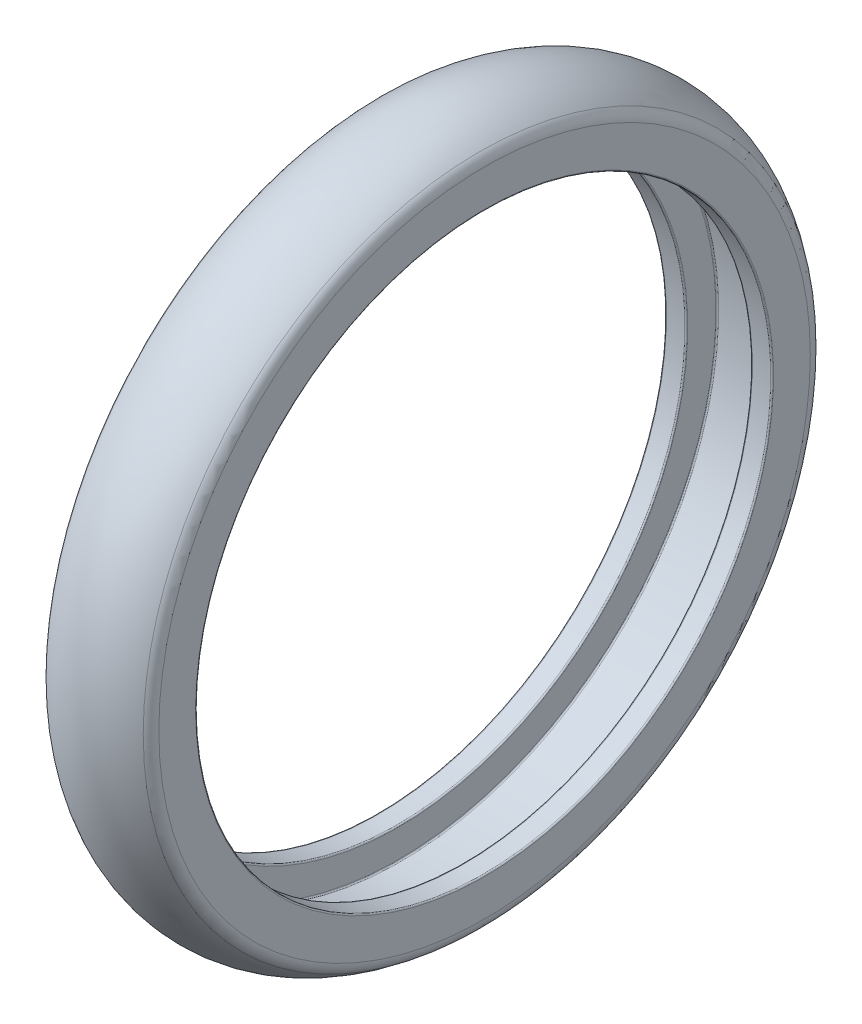
ISO-10303-21;
HEADER;
FILE_DESCRIPTION(('STEP AP214'),'2;1');
FILE_NAME('part.step','',(''),(''),'','','');
FILE_SCHEMA(('AUTOMOTIVE_DESIGN { 1 0 10303 214 1 1 1 1 }'));
ENDSEC;
DATA;
#1=APPLICATION_CONTEXT('core data for automotive mechanical design processes');
#2=APPLICATION_PROTOCOL_DEFINITION('international standard','automotive_design',2000,#1);
#3=PRODUCT_CONTEXT('',#1,'mechanical');
#4=PRODUCT('Part','Part','',(#3));
#5=PRODUCT_RELATED_PRODUCT_CATEGORY('part','',(#4));
#6=PRODUCT_DEFINITION_FORMATION('','',#4);
#7=PRODUCT_DEFINITION_CONTEXT('part definition',#1,'design');
#8=PRODUCT_DEFINITION('design','',#6,#7);
#9=PRODUCT_DEFINITION_SHAPE('','',#8);
#10=(LENGTH_UNIT() NAMED_UNIT(*) SI_UNIT(.MILLI.,.METRE.));
#11=(NAMED_UNIT(*) PLANE_ANGLE_UNIT() SI_UNIT($,.RADIAN.));
#12=(NAMED_UNIT(*) SI_UNIT($,.STERADIAN.) SOLID_ANGLE_UNIT());
#13=UNCERTAINTY_MEASURE_WITH_UNIT(LENGTH_MEASURE(1.E-05),#10,'distance_accuracy_value','');
#14=(GEOMETRIC_REPRESENTATION_CONTEXT(3) GLOBAL_UNCERTAINTY_ASSIGNED_CONTEXT((#13)) GLOBAL_UNIT_ASSIGNED_CONTEXT((#10,
#11,#12)) REPRESENTATION_CONTEXT('',''));
#15=CARTESIAN_POINT('',(0.,0.,0.));
#16=DIRECTION('',(0.,0.,1.));
#17=DIRECTION('',(1.,0.,0.));
#18=AXIS2_PLACEMENT_3D('',#15,#16,#17);
#19=CARTESIAN_POINT('',(2.27965,0.,0.));
#20=DIRECTION('',(-1.,0.,0.));
#21=DIRECTION('',(0.,0.,1.));
#22=AXIS2_PLACEMENT_3D('',#19,#20,#21);
#23=TOROIDAL_SURFACE('',#22,18.7006423557673,0.79375);
#24=CARTESIAN_POINT('',(2.78791956692352,0.,0.));
#25=DIRECTION('',(-1.,0.,0.));
#26=DIRECTION('',(0.,0.,1.));
#27=AXIS2_PLACEMENT_3D('',#24,#25,#26);
#28=CIRCLE('',#27,19.3103153089474);
#29=CARTESIAN_POINT('',(2.78791956692352,0.,19.3103153089474));
#30=VERTEX_POINT('',#29);
#31=EDGE_CURVE('E10',#30,#30,#28,.T.);
#32=ORIENTED_EDGE('',*,*,#31,.F.);
#33=EDGE_LOOP('',(#32));
#34=FACE_BOUND('',#33,.T.);
#35=CARTESIAN_POINT('',(3.0734,0.,0.));
#36=DIRECTION('',(-1.,0.,0.));
#37=DIRECTION('',(0.,0.,1.));
#38=AXIS2_PLACEMENT_3D('',#35,#36,#37);
#39=CIRCLE('',#38,18.7006423557673);
#40=CARTESIAN_POINT('',(3.0734,0.,18.7006423557673));
#41=VERTEX_POINT('',#40);
#42=EDGE_CURVE('E89',#41,#41,#39,.T.);
#43=ORIENTED_EDGE('',*,*,#42,.T.);
#44=EDGE_LOOP('',(#43));
#45=FACE_BOUND('',#44,.T.);
#46=ADVANCED_FACE('F37',(#34,#45),#23,.T.);
#47=CARTESIAN_POINT('',(0.,0.,0.));
#48=DIRECTION('',(-1.,0.,0.));
#49=DIRECTION('',(0.,0.,1.));
#50=AXIS2_PLACEMENT_3D('',#47,#48,#49);
#51=TOROIDAL_SURFACE('',#50,15.966186,4.353814);
#52=CARTESIAN_POINT('',(-2.78791956692352,0.,0.));
#53=DIRECTION('',(-1.,0.,0.));
#54=DIRECTION('',(0.,0.,1.));
#55=AXIS2_PLACEMENT_3D('',#52,#53,#54);
#56=CIRCLE('',#55,19.3103153089474);
#57=CARTESIAN_POINT('',(-2.78791956692352,0.,19.3103153089474));
#58=VERTEX_POINT('',#57);
#59=EDGE_CURVE('E43',#58,#58,#56,.T.);
#60=ORIENTED_EDGE('',*,*,#59,.F.);
#61=EDGE_LOOP('',(#60));
#62=FACE_BOUND('',#61,.T.);
#63=ORIENTED_EDGE('',*,*,#31,.T.);
#64=EDGE_LOOP('',(#63));
#65=FACE_BOUND('',#64,.T.);
#66=ADVANCED_FACE('F174',(#62,#65),#51,.T.);
#67=CARTESIAN_POINT('',(-2.27965,0.,0.));
#68=DIRECTION('',(-1.,0.,0.));
#69=DIRECTION('',(0.,0.,1.));
#70=AXIS2_PLACEMENT_3D('',#67,#68,#69);
#71=TOROIDAL_SURFACE('',#70,18.7006423557673,0.79375);
#72=CARTESIAN_POINT('',(-3.0734,0.,0.));
#73=DIRECTION('',(-1.,0.,0.));
#74=DIRECTION('',(0.,0.,1.));
#75=AXIS2_PLACEMENT_3D('',#72,#73,#74);
#76=CIRCLE('',#75,18.7006423557673);
#77=CARTESIAN_POINT('',(-3.0734,0.,18.7006423557673));
#78=VERTEX_POINT('',#77);
#79=EDGE_CURVE('E47',#78,#78,#76,.T.);
#80=ORIENTED_EDGE('',*,*,#79,.F.);
#81=EDGE_LOOP('',(#80));
#82=FACE_BOUND('',#81,.T.);
#83=ORIENTED_EDGE('',*,*,#59,.T.);
#84=EDGE_LOOP('',(#83));
#85=FACE_BOUND('',#84,.T.);
#86=ADVANCED_FACE('F169',(#82,#85),#71,.T.);
#87=CARTESIAN_POINT('',(-3.0734,16.589375,0.));
#88=DIRECTION('',(1.,0.,0.));
#89=DIRECTION('',(0.,0.,-1.));
#90=AXIS2_PLACEMENT_3D('',#87,#88,#89);
#91=PLANE('',#90);
#92=CARTESIAN_POINT('',(-3.0734,0.,0.));
#93=DIRECTION('',(-1.,0.,0.));
#94=DIRECTION('',(0.,0.,1.));
#95=AXIS2_PLACEMENT_3D('',#92,#93,#94);
#96=CIRCLE('',#95,16.589375);
#97=CARTESIAN_POINT('',(-3.0734,0.,16.589375));
#98=VERTEX_POINT('',#97);
#99=EDGE_CURVE('E51',#98,#98,#96,.T.);
#100=ORIENTED_EDGE('',*,*,#99,.F.);
#101=EDGE_LOOP('',(#100));
#102=FACE_BOUND('',#101,.T.);
#103=ORIENTED_EDGE('',*,*,#79,.T.);
#104=EDGE_LOOP('',(#103));
#105=FACE_BOUND('',#104,.T.);
#106=ADVANCED_FACE('F163',(#102,#105),#91,.F.);
#107=CARTESIAN_POINT('',(-2.994025,0.,0.));
#108=DIRECTION('',(-1.,0.,0.));
#109=DIRECTION('',(0.,0.,1.));
#110=AXIS2_PLACEMENT_3D('',#107,#108,#109);
#111=TOROIDAL_SURFACE('',#110,16.589375,0.0793749999999998);
#112=CARTESIAN_POINT('',(-2.994025,0.,0.));
#113=DIRECTION('',(-1.,0.,0.));
#114=DIRECTION('',(0.,0.,1.));
#115=AXIS2_PLACEMENT_3D('',#112,#113,#114);
#116=CIRCLE('',#115,16.51);
#117=CARTESIAN_POINT('',(-2.994025,0.,16.51));
#118=VERTEX_POINT('',#117);
#119=EDGE_CURVE('E56',#118,#118,#116,.T.);
#120=ORIENTED_EDGE('',*,*,#119,.F.);
#121=EDGE_LOOP('',(#120));
#122=FACE_BOUND('',#121,.T.);
#123=ORIENTED_EDGE('',*,*,#99,.T.);
#124=EDGE_LOOP('',(#123));
#125=FACE_BOUND('',#124,.T.);
#126=ADVANCED_FACE('F157',(#122,#125),#111,.T.);
#127=CARTESIAN_POINT('',(0.,0.,0.));
#128=DIRECTION('',(-1.,0.,0.));
#129=DIRECTION('',(0.,0.,1.));
#130=AXIS2_PLACEMENT_3D('',#127,#128,#129);
#131=CYLINDRICAL_SURFACE('',#130,16.51);
#132=CARTESIAN_POINT('',(-1.933575,0.,0.));
#133=DIRECTION('',(-1.,0.,0.));
#134=DIRECTION('',(0.,0.,1.));
#135=AXIS2_PLACEMENT_3D('',#132,#133,#134);
#136=CIRCLE('',#135,16.51);
#137=CARTESIAN_POINT('',(-1.933575,0.,16.51));
#138=VERTEX_POINT('',#137);
#139=EDGE_CURVE('E59',#138,#138,#136,.T.);
#140=ORIENTED_EDGE('',*,*,#139,.F.);
#141=EDGE_LOOP('',(#140));
#142=FACE_BOUND('',#141,.T.);
#143=ORIENTED_EDGE('',*,*,#119,.T.);
#144=EDGE_LOOP('',(#143));
#145=FACE_BOUND('',#144,.T.);
#146=ADVANCED_FACE('F151',(#142,#145),#131,.F.);
#147=CARTESIAN_POINT('',(-1.933575,0.,0.));
#148=DIRECTION('',(-1.,0.,0.));
#149=DIRECTION('',(0.,0.,1.));
#150=AXIS2_PLACEMENT_3D('',#147,#148,#149);
#151=TOROIDAL_SURFACE('',#150,16.589375,0.0793749999999998);
#152=CARTESIAN_POINT('',(-1.8542,0.,0.));
#153=DIRECTION('',(-1.,0.,0.));
#154=DIRECTION('',(0.,0.,1.));
#155=AXIS2_PLACEMENT_3D('',#152,#153,#154);
#156=CIRCLE('',#155,16.589375);
#157=CARTESIAN_POINT('',(-1.8542,0.,16.589375));
#158=VERTEX_POINT('',#157);
#159=EDGE_CURVE('E62',#158,#158,#156,.T.);
#160=ORIENTED_EDGE('',*,*,#159,.F.);
#161=EDGE_LOOP('',(#160));
#162=FACE_BOUND('',#161,.T.);
#163=ORIENTED_EDGE('',*,*,#139,.T.);
#164=EDGE_LOOP('',(#163));
#165=FACE_BOUND('',#164,.T.);
#166=ADVANCED_FACE('F145',(#162,#165),#151,.T.);
#167=CARTESIAN_POINT('',(-1.8542,18.208625,0.));
#168=DIRECTION('',(-1.,0.,0.));
#169=DIRECTION('',(0.,0.,1.));
#170=AXIS2_PLACEMENT_3D('',#167,#168,#169);
#171=PLANE('',#170);
#172=CARTESIAN_POINT('',(-1.8542,0.,0.));
#173=DIRECTION('',(-1.,0.,0.));
#174=DIRECTION('',(0.,0.,1.));
#175=AXIS2_PLACEMENT_3D('',#172,#173,#174);
#176=CIRCLE('',#175,18.208625);
#177=CARTESIAN_POINT('',(-1.8542,0.,18.208625));
#178=VERTEX_POINT('',#177);
#179=EDGE_CURVE('E65',#178,#178,#176,.T.);
#180=ORIENTED_EDGE('',*,*,#179,.F.);
#181=EDGE_LOOP('',(#180));
#182=FACE_BOUND('',#181,.T.);
#183=ORIENTED_EDGE('',*,*,#159,.T.);
#184=EDGE_LOOP('',(#183));
#185=FACE_BOUND('',#184,.T.);
#186=ADVANCED_FACE('F139',(#182,#185),#171,.F.);
#187=CARTESIAN_POINT('',(-1.774825,0.,0.));
#188=DIRECTION('',(-1.,0.,0.));
#189=DIRECTION('',(0.,0.,1.));
#190=AXIS2_PLACEMENT_3D('',#187,#188,#189);
#191=TOROIDAL_SURFACE('',#190,18.208625,0.0793749999999998);
#192=CARTESIAN_POINT('',(-1.774825,0.,0.));
#193=DIRECTION('',(-1.,0.,0.));
#194=DIRECTION('',(0.,0.,1.));
#195=AXIS2_PLACEMENT_3D('',#192,#193,#194);
#196=CIRCLE('',#195,18.288);
#197=CARTESIAN_POINT('',(-1.774825,0.,18.288));
#198=VERTEX_POINT('',#197);
#199=EDGE_CURVE('E68',#198,#198,#196,.T.);
#200=ORIENTED_EDGE('',*,*,#199,.F.);
#201=EDGE_LOOP('',(#200));
#202=FACE_BOUND('',#201,.T.);
#203=ORIENTED_EDGE('',*,*,#179,.T.);
#204=EDGE_LOOP('',(#203));
#205=FACE_BOUND('',#204,.T.);
#206=ADVANCED_FACE('F133',(#202,#205),#191,.F.);
#207=CARTESIAN_POINT('',(0.,0.,0.));
#208=DIRECTION('',(-1.,0.,0.));
#209=DIRECTION('',(0.,0.,1.));
#210=AXIS2_PLACEMENT_3D('',#207,#208,#209);
#211=CYLINDRICAL_SURFACE('',#210,18.288);
#212=CARTESIAN_POINT('',(1.774825,0.,0.));
#213=DIRECTION('',(-1.,0.,0.));
#214=DIRECTION('',(0.,0.,1.));
#215=AXIS2_PLACEMENT_3D('',#212,#213,#214);
#216=CIRCLE('',#215,18.288);
#217=CARTESIAN_POINT('',(1.774825,0.,18.288));
#218=VERTEX_POINT('',#217);
#219=EDGE_CURVE('E71',#218,#218,#216,.T.);
#220=ORIENTED_EDGE('',*,*,#219,.F.);
#221=EDGE_LOOP('',(#220));
#222=FACE_BOUND('',#221,.T.);
#223=ORIENTED_EDGE('',*,*,#199,.T.);
#224=EDGE_LOOP('',(#223));
#225=FACE_BOUND('',#224,.T.);
#226=ADVANCED_FACE('F127',(#222,#225),#211,.F.);
#227=CARTESIAN_POINT('',(1.774825,0.,0.));
#228=DIRECTION('',(-1.,0.,0.));
#229=DIRECTION('',(0.,0.,1.));
#230=AXIS2_PLACEMENT_3D('',#227,#228,#229);
#231=TOROIDAL_SURFACE('',#230,18.208625,0.0793749999999998);
#232=CARTESIAN_POINT('',(1.8542,0.,0.));
#233=DIRECTION('',(-1.,0.,0.));
#234=DIRECTION('',(0.,0.,1.));
#235=AXIS2_PLACEMENT_3D('',#232,#233,#234);
#236=CIRCLE('',#235,18.208625);
#237=CARTESIAN_POINT('',(1.8542,0.,18.208625));
#238=VERTEX_POINT('',#237);
#239=EDGE_CURVE('E74',#238,#238,#236,.T.);
#240=ORIENTED_EDGE('',*,*,#239,.F.);
#241=EDGE_LOOP('',(#240));
#242=FACE_BOUND('',#241,.T.);
#243=ORIENTED_EDGE('',*,*,#219,.T.);
#244=EDGE_LOOP('',(#243));
#245=FACE_BOUND('',#244,.T.);
#246=ADVANCED_FACE('F121',(#242,#245),#231,.F.);
#247=CARTESIAN_POINT('',(1.8542,18.208625,0.));
#248=DIRECTION('',(1.,0.,0.));
#249=DIRECTION('',(0.,0.,-1.));
#250=AXIS2_PLACEMENT_3D('',#247,#248,#249);
#251=PLANE('',#250);
#252=CARTESIAN_POINT('',(1.8542,0.,0.));
#253=DIRECTION('',(-1.,0.,0.));
#254=DIRECTION('',(0.,0.,1.));
#255=AXIS2_PLACEMENT_3D('',#252,#253,#254);
#256=CIRCLE('',#255,16.589375);
#257=CARTESIAN_POINT('',(1.8542,0.,16.589375));
#258=VERTEX_POINT('',#257);
#259=EDGE_CURVE('E77',#258,#258,#256,.T.);
#260=ORIENTED_EDGE('',*,*,#259,.F.);
#261=EDGE_LOOP('',(#260));
#262=FACE_BOUND('',#261,.T.);
#263=ORIENTED_EDGE('',*,*,#239,.T.);
#264=EDGE_LOOP('',(#263));
#265=FACE_BOUND('',#264,.T.);
#266=ADVANCED_FACE('F115',(#262,#265),#251,.F.);
#267=CARTESIAN_POINT('',(1.933575,0.,0.));
#268=DIRECTION('',(-1.,0.,0.));
#269=DIRECTION('',(0.,0.,1.));
#270=AXIS2_PLACEMENT_3D('',#267,#268,#269);
#271=TOROIDAL_SURFACE('',#270,16.589375,0.0793749999999998);
#272=CARTESIAN_POINT('',(1.933575,0.,0.));
#273=DIRECTION('',(-1.,0.,0.));
#274=DIRECTION('',(0.,0.,1.));
#275=AXIS2_PLACEMENT_3D('',#272,#273,#274);
#276=CIRCLE('',#275,16.51);
#277=CARTESIAN_POINT('',(1.933575,0.,16.51));
#278=VERTEX_POINT('',#277);
#279=EDGE_CURVE('E80',#278,#278,#276,.T.);
#280=ORIENTED_EDGE('',*,*,#279,.F.);
#281=EDGE_LOOP('',(#280));
#282=FACE_BOUND('',#281,.T.);
#283=ORIENTED_EDGE('',*,*,#259,.T.);
#284=EDGE_LOOP('',(#283));
#285=FACE_BOUND('',#284,.T.);
#286=ADVANCED_FACE('F109',(#282,#285),#271,.T.);
#287=CARTESIAN_POINT('',(0.,0.,0.));
#288=DIRECTION('',(-1.,0.,0.));
#289=DIRECTION('',(0.,0.,1.));
#290=AXIS2_PLACEMENT_3D('',#287,#288,#289);
#291=CYLINDRICAL_SURFACE('',#290,16.51);
#292=CARTESIAN_POINT('',(2.994025,0.,0.));
#293=DIRECTION('',(-1.,0.,0.));
#294=DIRECTION('',(0.,0.,1.));
#295=AXIS2_PLACEMENT_3D('',#292,#293,#294);
#296=CIRCLE('',#295,16.51);
#297=CARTESIAN_POINT('',(2.994025,0.,16.51));
#298=VERTEX_POINT('',#297);
#299=EDGE_CURVE('E83',#298,#298,#296,.T.);
#300=ORIENTED_EDGE('',*,*,#299,.F.);
#301=EDGE_LOOP('',(#300));
#302=FACE_BOUND('',#301,.T.);
#303=ORIENTED_EDGE('',*,*,#279,.T.);
#304=EDGE_LOOP('',(#303));
#305=FACE_BOUND('',#304,.T.);
#306=ADVANCED_FACE('F103',(#302,#305),#291,.F.);
#307=CARTESIAN_POINT('',(2.994025,0.,0.));
#308=DIRECTION('',(-1.,0.,0.));
#309=DIRECTION('',(0.,0.,1.));
#310=AXIS2_PLACEMENT_3D('',#307,#308,#309);
#311=TOROIDAL_SURFACE('',#310,16.589375,0.0793749999999998);
#312=CARTESIAN_POINT('',(3.0734,0.,0.));
#313=DIRECTION('',(-1.,0.,0.));
#314=DIRECTION('',(0.,0.,1.));
#315=AXIS2_PLACEMENT_3D('',#312,#313,#314);
#316=CIRCLE('',#315,16.589375);
#317=CARTESIAN_POINT('',(3.0734,0.,16.589375));
#318=VERTEX_POINT('',#317);
#319=EDGE_CURVE('E86',#318,#318,#316,.T.);
#320=ORIENTED_EDGE('',*,*,#319,.F.);
#321=EDGE_LOOP('',(#320));
#322=FACE_BOUND('',#321,.T.);
#323=ORIENTED_EDGE('',*,*,#299,.T.);
#324=EDGE_LOOP('',(#323));
#325=FACE_BOUND('',#324,.T.);
#326=ADVANCED_FACE('F97',(#322,#325),#311,.T.);
#327=CARTESIAN_POINT('',(3.0734,16.589375,0.));
#328=DIRECTION('',(-1.,0.,0.));
#329=DIRECTION('',(0.,0.,1.));
#330=AXIS2_PLACEMENT_3D('',#327,#328,#329);
#331=PLANE('',#330);
#332=ORIENTED_EDGE('',*,*,#42,.F.);
#333=EDGE_LOOP('',(#332));
#334=FACE_BOUND('',#333,.T.);
#335=ORIENTED_EDGE('',*,*,#319,.T.);
#336=EDGE_LOOP('',(#335));
#337=FACE_BOUND('',#336,.T.);
#338=ADVANCED_FACE('F94',(#334,#337),#331,.F.);
#339=CLOSED_SHELL('',(#46,#66,#86,#106,#126,#146,#166,#186,#206,#226,#246,#266,#286,#306,#326,#338));
#340=MANIFOLD_SOLID_BREP('B2',#339);
#341=ADVANCED_BREP_SHAPE_REPRESENTATION('',(#18,#340),#14);
#342=SHAPE_DEFINITION_REPRESENTATION(#9,#341);
ENDSEC;
END-ISO-10303-21;
